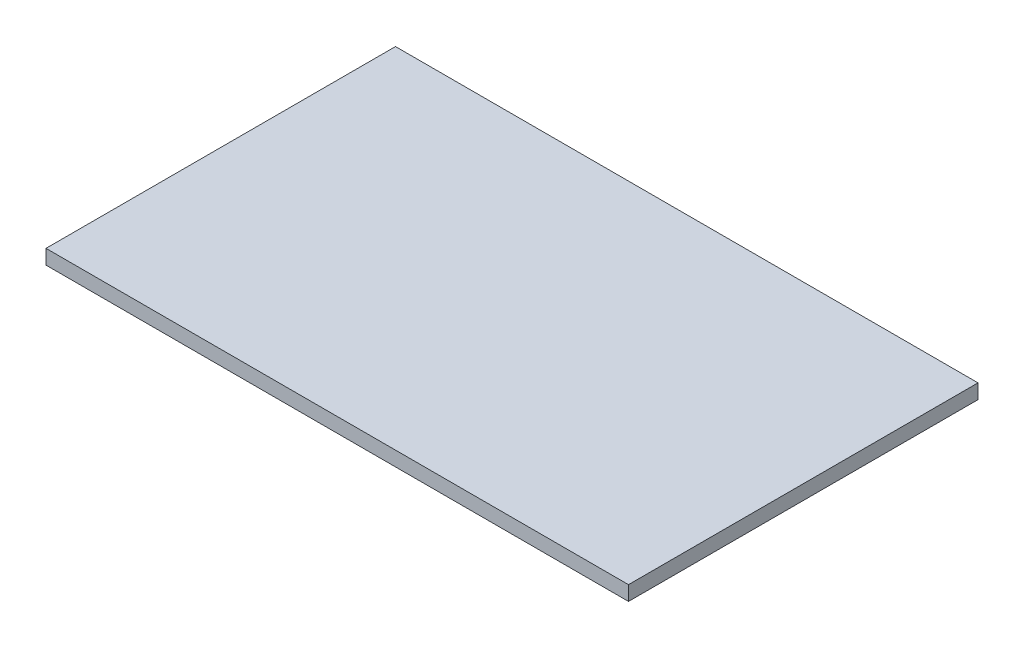
ISO-10303-21;
HEADER;
FILE_DESCRIPTION(('STEP AP214'),'2;1');
FILE_NAME('part.step','',(''),(''),'','','');
FILE_SCHEMA(('AUTOMOTIVE_DESIGN { 1 0 10303 214 1 1 1 1 }'));
ENDSEC;
DATA;
#1=APPLICATION_CONTEXT('core data for automotive mechanical design processes');
#2=APPLICATION_PROTOCOL_DEFINITION('international standard','automotive_design',2000,#1);
#3=PRODUCT_CONTEXT('',#1,'mechanical');
#4=PRODUCT('Part','Part','',(#3));
#5=PRODUCT_RELATED_PRODUCT_CATEGORY('part','',(#4));
#6=PRODUCT_DEFINITION_FORMATION('','',#4);
#7=PRODUCT_DEFINITION_CONTEXT('part definition',#1,'design');
#8=PRODUCT_DEFINITION('design','',#6,#7);
#9=PRODUCT_DEFINITION_SHAPE('','',#8);
#10=(LENGTH_UNIT() NAMED_UNIT(*) SI_UNIT(.MILLI.,.METRE.));
#11=(NAMED_UNIT(*) PLANE_ANGLE_UNIT() SI_UNIT($,.RADIAN.));
#12=(NAMED_UNIT(*) SI_UNIT($,.STERADIAN.) SOLID_ANGLE_UNIT());
#13=UNCERTAINTY_MEASURE_WITH_UNIT(LENGTH_MEASURE(1.E-05),#10,'distance_accuracy_value','');
#14=(GEOMETRIC_REPRESENTATION_CONTEXT(3) GLOBAL_UNCERTAINTY_ASSIGNED_CONTEXT((#13)) GLOBAL_UNIT_ASSIGNED_CONTEXT((#10,
#11,#12)) REPRESENTATION_CONTEXT('',''));
#15=CARTESIAN_POINT('',(0.,0.,0.));
#16=DIRECTION('',(0.,0.,1.));
#17=DIRECTION('',(1.,0.,0.));
#18=AXIS2_PLACEMENT_3D('',#15,#16,#17);
#19=CARTESIAN_POINT('',(40.,4.,-24.));
#20=DIRECTION('',(1.,0.,0.));
#21=DIRECTION('',(0.,0.,-1.));
#22=AXIS2_PLACEMENT_3D('',#19,#20,#21);
#23=PLANE('',#22);
#24=DIRECTION('',(0.,0.,1.));
#25=VECTOR('',#24,1.);
#26=CARTESIAN_POINT('',(40.,1.,-24.));
#27=LINE('',#26,#25);
#28=CARTESIAN_POINT('',(40.,1.,-96.));
#29=VERTEX_POINT('',#28);
#30=CARTESIAN_POINT('',(40.,1.,-24.));
#31=VERTEX_POINT('',#30);
#32=EDGE_CURVE('E98',#29,#31,#27,.T.);
#33=ORIENTED_EDGE('',*,*,#32,.T.);
#34=DIRECTION('',(0.,-1.,0.));
#35=VECTOR('',#34,1.);
#36=CARTESIAN_POINT('',(40.,4.,-24.));
#37=LINE('',#36,#35);
#38=CARTESIAN_POINT('',(40.,4.,-24.));
#39=VERTEX_POINT('',#38);
#40=EDGE_CURVE('E11',#39,#31,#37,.T.);
#41=ORIENTED_EDGE('',*,*,#40,.F.);
#42=DIRECTION('',(0.,0.,1.));
#43=VECTOR('',#42,1.);
#44=CARTESIAN_POINT('',(40.,4.,-24.));
#45=LINE('',#44,#43);
#46=CARTESIAN_POINT('',(40.,4.,-96.));
#47=VERTEX_POINT('',#46);
#48=EDGE_CURVE('E86',#47,#39,#45,.T.);
#49=ORIENTED_EDGE('',*,*,#48,.F.);
#50=DIRECTION('',(0.,-1.,0.));
#51=VECTOR('',#50,1.);
#52=CARTESIAN_POINT('',(40.,4.,-96.));
#53=LINE('',#52,#51);
#54=EDGE_CURVE('E94',#47,#29,#53,.T.);
#55=ORIENTED_EDGE('',*,*,#54,.T.);
#56=EDGE_LOOP('',(#33,#41,#49,#55));
#57=FACE_BOUND('',#56,.T.);
#58=ADVANCED_FACE('F35',(#57),#23,.F.);
#59=CARTESIAN_POINT('',(40.,4.,-24.));
#60=DIRECTION('',(0.,0.,-1.));
#61=DIRECTION('',(-1.,0.,0.));
#62=AXIS2_PLACEMENT_3D('',#59,#60,#61);
#63=PLANE('',#62);
#64=DIRECTION('',(1.,0.,0.));
#65=VECTOR('',#64,1.);
#66=CARTESIAN_POINT('',(40.,1.,-24.));
#67=LINE('',#66,#65);
#68=CARTESIAN_POINT('',(160.,1.,-24.));
#69=VERTEX_POINT('',#68);
#70=EDGE_CURVE('E90',#31,#69,#67,.T.);
#71=ORIENTED_EDGE('',*,*,#70,.T.);
#72=DIRECTION('',(0.,-1.,0.));
#73=VECTOR('',#72,1.);
#74=CARTESIAN_POINT('',(160.,4.,-24.));
#75=LINE('',#74,#73);
#76=CARTESIAN_POINT('',(160.,4.,-24.));
#77=VERTEX_POINT('',#76);
#78=EDGE_CURVE('E43',#77,#69,#75,.T.);
#79=ORIENTED_EDGE('',*,*,#78,.F.);
#80=DIRECTION('',(1.,0.,0.));
#81=VECTOR('',#80,1.);
#82=CARTESIAN_POINT('',(40.,4.,-24.));
#83=LINE('',#82,#81);
#84=EDGE_CURVE('E81',#39,#77,#83,.T.);
#85=ORIENTED_EDGE('',*,*,#84,.F.);
#86=ORIENTED_EDGE('',*,*,#40,.T.);
#87=EDGE_LOOP('',(#71,#79,#85,#86));
#88=FACE_BOUND('',#87,.T.);
#89=ADVANCED_FACE('F89',(#88),#63,.F.);
#90=CARTESIAN_POINT('',(160.,4.,-24.));
#91=DIRECTION('',(-1.,0.,0.));
#92=DIRECTION('',(0.,0.,1.));
#93=AXIS2_PLACEMENT_3D('',#90,#91,#92);
#94=PLANE('',#93);
#95=DIRECTION('',(0.,0.,-1.));
#96=VECTOR('',#95,1.);
#97=CARTESIAN_POINT('',(160.,1.,-24.));
#98=LINE('',#97,#96);
#99=CARTESIAN_POINT('',(160.,1.,-96.));
#100=VERTEX_POINT('',#99);
#101=EDGE_CURVE('E68',#69,#100,#98,.T.);
#102=ORIENTED_EDGE('',*,*,#101,.T.);
#103=DIRECTION('',(0.,-1.,0.));
#104=VECTOR('',#103,1.);
#105=CARTESIAN_POINT('',(160.,4.,-96.));
#106=LINE('',#105,#104);
#107=CARTESIAN_POINT('',(160.,4.,-96.));
#108=VERTEX_POINT('',#107);
#109=EDGE_CURVE('E91',#108,#100,#106,.T.);
#110=ORIENTED_EDGE('',*,*,#109,.F.);
#111=DIRECTION('',(0.,0.,-1.));
#112=VECTOR('',#111,1.);
#113=CARTESIAN_POINT('',(160.,4.,-24.));
#114=LINE('',#113,#112);
#115=EDGE_CURVE('E84',#77,#108,#114,.T.);
#116=ORIENTED_EDGE('',*,*,#115,.F.);
#117=ORIENTED_EDGE('',*,*,#78,.T.);
#118=EDGE_LOOP('',(#102,#110,#116,#117));
#119=FACE_BOUND('',#118,.T.);
#120=ADVANCED_FACE('F92',(#119),#94,.F.);
#121=CARTESIAN_POINT('',(40.,4.,-96.));
#122=DIRECTION('',(0.,0.,1.));
#123=DIRECTION('',(1.,0.,0.));
#124=AXIS2_PLACEMENT_3D('',#121,#122,#123);
#125=PLANE('',#124);
#126=DIRECTION('',(-1.,0.,0.));
#127=VECTOR('',#126,1.);
#128=CARTESIAN_POINT('',(40.,1.,-96.));
#129=LINE('',#128,#127);
#130=EDGE_CURVE('E74',#100,#29,#129,.T.);
#131=ORIENTED_EDGE('',*,*,#130,.T.);
#132=ORIENTED_EDGE('',*,*,#54,.F.);
#133=DIRECTION('',(-1.,0.,0.));
#134=VECTOR('',#133,1.);
#135=CARTESIAN_POINT('',(40.,4.,-96.));
#136=LINE('',#135,#134);
#137=EDGE_CURVE('E51',#108,#47,#136,.T.);
#138=ORIENTED_EDGE('',*,*,#137,.F.);
#139=ORIENTED_EDGE('',*,*,#109,.T.);
#140=EDGE_LOOP('',(#131,#132,#138,#139));
#141=FACE_BOUND('',#140,.T.);
#142=ADVANCED_FACE('F105',(#141),#125,.F.);
#143=CARTESIAN_POINT('',(40.,4.,-24.));
#144=DIRECTION('',(0.,-1.,0.));
#145=DIRECTION('',(0.,0.,-1.));
#146=AXIS2_PLACEMENT_3D('',#143,#144,#145);
#147=PLANE('',#146);
#148=ORIENTED_EDGE('',*,*,#48,.T.);
#149=ORIENTED_EDGE('',*,*,#84,.T.);
#150=ORIENTED_EDGE('',*,*,#115,.T.);
#151=ORIENTED_EDGE('',*,*,#137,.T.);
#152=EDGE_LOOP('',(#148,#149,#150,#151));
#153=FACE_BOUND('',#152,.T.);
#154=ADVANCED_FACE('F82',(#153),#147,.F.);
#155=CARTESIAN_POINT('',(40.,1.,-24.));
#156=DIRECTION('',(0.,-1.,0.));
#157=DIRECTION('',(0.,0.,-1.));
#158=AXIS2_PLACEMENT_3D('',#155,#156,#157);
#159=PLANE('',#158);
#160=ORIENTED_EDGE('',*,*,#32,.F.);
#161=ORIENTED_EDGE('',*,*,#130,.F.);
#162=ORIENTED_EDGE('',*,*,#101,.F.);
#163=ORIENTED_EDGE('',*,*,#70,.F.);
#164=EDGE_LOOP('',(#160,#161,#162,#163));
#165=FACE_BOUND('',#164,.T.);
#166=ADVANCED_FACE('F108',(#165),#159,.T.);
#167=CLOSED_SHELL('',(#58,#89,#120,#142,#154,#166));
#168=MANIFOLD_SOLID_BREP('B2',#167);
#169=ADVANCED_BREP_SHAPE_REPRESENTATION('',(#18,#168),#14);
#170=SHAPE_DEFINITION_REPRESENTATION(#9,#169);
ENDSEC;
END-ISO-10303-21;
